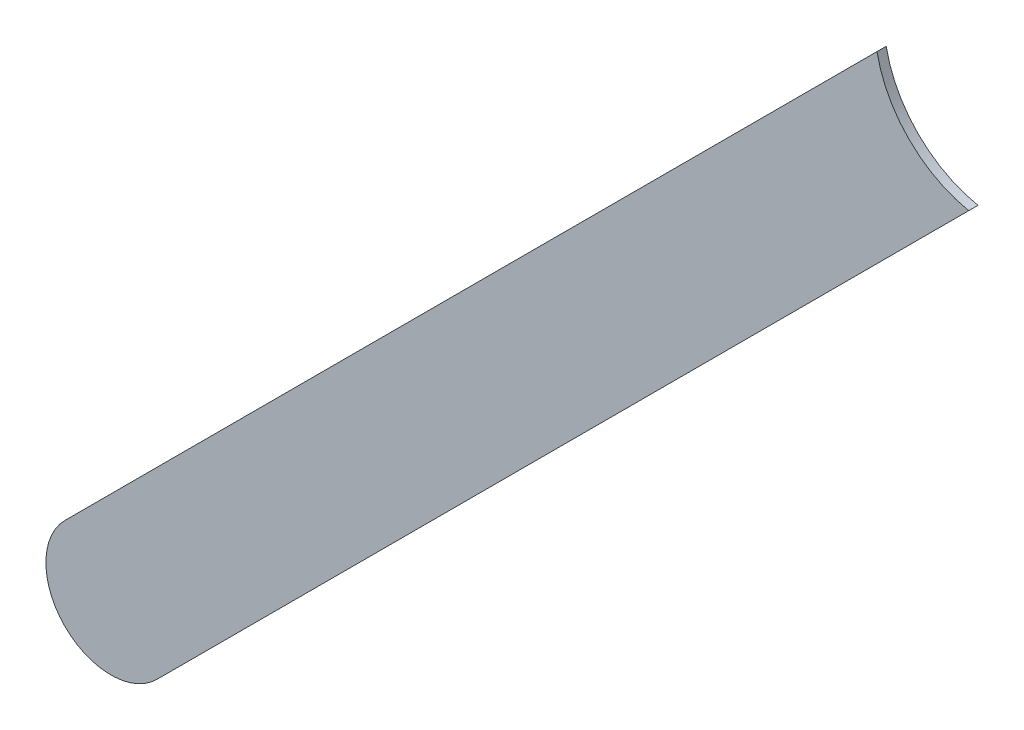
ISO-10303-21;
HEADER;
FILE_DESCRIPTION(('STEP AP214'),'2;1');
FILE_NAME('part.step','',(''),(''),'','','');
FILE_SCHEMA(('AUTOMOTIVE_DESIGN { 1 0 10303 214 1 1 1 1 }'));
ENDSEC;
DATA;
#1=APPLICATION_CONTEXT('core data for automotive mechanical design processes');
#2=APPLICATION_PROTOCOL_DEFINITION('international standard','automotive_design',2000,#1);
#3=PRODUCT_CONTEXT('',#1,'mechanical');
#4=PRODUCT('Part','Part','',(#3));
#5=PRODUCT_RELATED_PRODUCT_CATEGORY('part','',(#4));
#6=PRODUCT_DEFINITION_FORMATION('','',#4);
#7=PRODUCT_DEFINITION_CONTEXT('part definition',#1,'design');
#8=PRODUCT_DEFINITION('design','',#6,#7);
#9=PRODUCT_DEFINITION_SHAPE('','',#8);
#10=(LENGTH_UNIT() NAMED_UNIT(*) SI_UNIT(.MILLI.,.METRE.));
#11=(NAMED_UNIT(*) PLANE_ANGLE_UNIT() SI_UNIT($,.RADIAN.));
#12=(NAMED_UNIT(*) SI_UNIT($,.STERADIAN.) SOLID_ANGLE_UNIT());
#13=UNCERTAINTY_MEASURE_WITH_UNIT(LENGTH_MEASURE(1.E-05),#10,'distance_accuracy_value','');
#14=(GEOMETRIC_REPRESENTATION_CONTEXT(3) GLOBAL_UNCERTAINTY_ASSIGNED_CONTEXT((#13)) GLOBAL_UNIT_ASSIGNED_CONTEXT((#10,
#11,#12)) REPRESENTATION_CONTEXT('',''));
#15=CARTESIAN_POINT('',(0.,0.,0.));
#16=DIRECTION('',(0.,0.,1.));
#17=DIRECTION('',(1.,0.,0.));
#18=AXIS2_PLACEMENT_3D('',#15,#16,#17);
#19=CARTESIAN_POINT('',(88.07677584,113.46023028,0.));
#20=DIRECTION('',(-0.707106781186549,0.707106781186546,0.));
#21=DIRECTION('',(0.707106781186546,0.707106781186549,0.));
#22=AXIS2_PLACEMENT_3D('',#19,#20,#21);
#23=PLANE('',#22);
#24=DIRECTION('',(0.707106781186546,0.707106781186549,0.));
#25=VECTOR('',#24,1.);
#26=CARTESIAN_POINT('',(88.07677584,113.46023028,0.03556));
#27=LINE('',#26,#25);
#28=CARTESIAN_POINT('',(88.07677584,113.46023028,0.03556));
#29=VERTEX_POINT('',#28);
#30=CARTESIAN_POINT('',(91.2032054036052,116.586659843605,0.03556));
#31=VERTEX_POINT('',#30);
#32=EDGE_CURVE('E11',#29,#31,#27,.T.);
#33=ORIENTED_EDGE('',*,*,#32,.F.);
#34=DIRECTION('',(0.,0.,1.));
#35=VECTOR('',#34,1.);
#36=CARTESIAN_POINT('',(88.07677584,113.46023028,0.));
#37=LINE('',#36,#35);
#38=CARTESIAN_POINT('',(88.07677584,113.46023028,0.));
#39=VERTEX_POINT('',#38);
#40=EDGE_CURVE('E24',#39,#29,#37,.T.);
#41=ORIENTED_EDGE('',*,*,#40,.F.);
#42=DIRECTION('',(0.707106781186546,0.707106781186549,0.));
#43=VECTOR('',#42,1.);
#44=CARTESIAN_POINT('',(88.07677584,113.46023028,0.));
#45=LINE('',#44,#43);
#46=CARTESIAN_POINT('',(91.2032054036052,116.586659843605,0.));
#47=VERTEX_POINT('',#46);
#48=EDGE_CURVE('E75',#39,#47,#45,.T.);
#49=ORIENTED_EDGE('',*,*,#48,.T.);
#50=DIRECTION('',(0.,0.,1.));
#51=VECTOR('',#50,1.);
#52=CARTESIAN_POINT('',(91.2032054036052,116.586659843605,0.));
#53=LINE('',#52,#51);
#54=EDGE_CURVE('E37',#47,#31,#53,.T.);
#55=ORIENTED_EDGE('',*,*,#54,.T.);
#56=EDGE_LOOP('',(#33,#41,#49,#55));
#57=FACE_BOUND('',#56,.T.);
#58=ADVANCED_FACE('F17',(#57),#23,.F.);
#59=CARTESIAN_POINT('',(91.2910036,117.0280108,0.));
#60=DIRECTION('',(0.,0.,-1.));
#61=DIRECTION('',(1.,0.,0.));
#62=AXIS2_PLACEMENT_3D('',#59,#60,#61);
#63=CYLINDRICAL_SURFACE('',#62,0.4499991);
#64=DIRECTION('',(0.,0.,1.));
#65=VECTOR('',#64,1.);
#66=CARTESIAN_POINT('',(90.8496526436052,116.940212603605,0.));
#67=LINE('',#66,#65);
#68=CARTESIAN_POINT('',(90.8496526436052,116.940212603605,0.));
#69=VERTEX_POINT('',#68);
#70=CARTESIAN_POINT('',(90.8496526436052,116.940212603605,0.03556));
#71=VERTEX_POINT('',#70);
#72=EDGE_CURVE('E67',#69,#71,#67,.T.);
#73=ORIENTED_EDGE('',*,*,#72,.T.);
#74=CARTESIAN_POINT('',(91.2910036,117.0280108,0.03556));
#75=DIRECTION('',(0.,0.,1.));
#76=DIRECTION('',(1.,0.,0.));
#77=AXIS2_PLACEMENT_3D('',#74,#75,#76);
#78=CIRCLE('',#77,0.4499991);
#79=EDGE_CURVE('E82',#71,#31,#78,.T.);
#80=ORIENTED_EDGE('',*,*,#79,.T.);
#81=ORIENTED_EDGE('',*,*,#54,.F.);
#82=CARTESIAN_POINT('',(91.2910036,117.0280108,0.));
#83=DIRECTION('',(0.,0.,1.));
#84=DIRECTION('',(1.,0.,0.));
#85=AXIS2_PLACEMENT_3D('',#82,#83,#84);
#86=CIRCLE('',#85,0.4499991);
#87=EDGE_CURVE('E80',#69,#47,#86,.T.);
#88=ORIENTED_EDGE('',*,*,#87,.F.);
#89=EDGE_LOOP('',(#73,#80,#81,#88));
#90=FACE_BOUND('',#89,.T.);
#91=ADVANCED_FACE('F88',(#90),#63,.F.);
#92=CARTESIAN_POINT('',(90.8496526436052,116.940212603605,0.));
#93=DIRECTION('',(0.707106781186546,-0.707106781186549,0.));
#94=DIRECTION('',(-0.707106781186549,-0.707106781186546,0.));
#95=AXIS2_PLACEMENT_3D('',#92,#93,#94);
#96=PLANE('',#95);
#97=DIRECTION('',(-0.707106781186549,-0.707106781186546,0.));
#98=VECTOR('',#97,1.);
#99=CARTESIAN_POINT('',(91.11422722,117.20478718,0.03556));
#100=LINE('',#99,#98);
#101=CARTESIAN_POINT('',(87.72322308,113.81378304,0.03556));
#102=VERTEX_POINT('',#101);
#103=EDGE_CURVE('E71',#71,#102,#100,.T.);
#104=ORIENTED_EDGE('',*,*,#103,.F.);
#105=ORIENTED_EDGE('',*,*,#72,.F.);
#106=DIRECTION('',(-0.707106781186549,-0.707106781186546,0.));
#107=VECTOR('',#106,1.);
#108=CARTESIAN_POINT('',(91.11422722,117.20478718,0.));
#109=LINE('',#108,#107);
#110=CARTESIAN_POINT('',(87.72322308,113.81378304,0.));
#111=VERTEX_POINT('',#110);
#112=EDGE_CURVE('E63',#69,#111,#109,.T.);
#113=ORIENTED_EDGE('',*,*,#112,.T.);
#114=DIRECTION('',(0.,0.,1.));
#115=VECTOR('',#114,1.);
#116=CARTESIAN_POINT('',(87.72322308,113.81378304,0.));
#117=LINE('',#116,#115);
#118=EDGE_CURVE('E53',#111,#102,#117,.T.);
#119=ORIENTED_EDGE('',*,*,#118,.T.);
#120=EDGE_LOOP('',(#104,#105,#113,#119));
#121=FACE_BOUND('',#120,.T.);
#122=ADVANCED_FACE('F66',(#121),#96,.F.);
#123=CARTESIAN_POINT('',(87.89999946,113.63700666,0.));
#124=DIRECTION('',(0.,0.,-1.));
#125=DIRECTION('',(-0.707106781186576,0.707106781186519,0.));
#126=AXIS2_PLACEMENT_3D('',#123,#124,#125);
#127=CYLINDRICAL_SURFACE('',#126,0.249999554103223);
#128=CARTESIAN_POINT('',(87.89999946,113.63700666,0.03556));
#129=DIRECTION('',(0.,0.,1.));
#130=DIRECTION('',(-0.707106781186576,0.707106781186519,0.));
#131=AXIS2_PLACEMENT_3D('',#128,#129,#130);
#132=CIRCLE('',#131,0.249999554103223);
#133=EDGE_CURVE('E59',#102,#29,#132,.T.);
#134=ORIENTED_EDGE('',*,*,#133,.F.);
#135=ORIENTED_EDGE('',*,*,#118,.F.);
#136=CARTESIAN_POINT('',(87.89999946,113.63700666,0.));
#137=DIRECTION('',(0.,0.,1.));
#138=DIRECTION('',(-0.707106781186576,0.707106781186519,0.));
#139=AXIS2_PLACEMENT_3D('',#136,#137,#138);
#140=CIRCLE('',#139,0.249999554103223);
#141=EDGE_CURVE('E57',#111,#39,#140,.T.);
#142=ORIENTED_EDGE('',*,*,#141,.T.);
#143=ORIENTED_EDGE('',*,*,#40,.T.);
#144=EDGE_LOOP('',(#134,#135,#142,#143));
#145=FACE_BOUND('',#144,.T.);
#146=ADVANCED_FACE('F55',(#145),#127,.T.);
#147=CARTESIAN_POINT('',(88.07677584,113.46023028,0.));
#148=DIRECTION('',(0.,0.,-1.));
#149=DIRECTION('',(-1.,0.,0.));
#150=AXIS2_PLACEMENT_3D('',#147,#148,#149);
#151=PLANE('',#150);
#152=ORIENTED_EDGE('',*,*,#48,.F.);
#153=ORIENTED_EDGE('',*,*,#141,.F.);
#154=ORIENTED_EDGE('',*,*,#112,.F.);
#155=ORIENTED_EDGE('',*,*,#87,.T.);
#156=EDGE_LOOP('',(#152,#153,#154,#155));
#157=FACE_BOUND('',#156,.T.);
#158=ADVANCED_FACE('F74',(#157),#151,.T.);
#159=CARTESIAN_POINT('',(88.07677584,113.46023028,0.03556));
#160=DIRECTION('',(0.,0.,-1.));
#161=DIRECTION('',(-1.,0.,0.));
#162=AXIS2_PLACEMENT_3D('',#159,#160,#161);
#163=PLANE('',#162);
#164=ORIENTED_EDGE('',*,*,#133,.T.);
#165=ORIENTED_EDGE('',*,*,#32,.T.);
#166=ORIENTED_EDGE('',*,*,#79,.F.);
#167=ORIENTED_EDGE('',*,*,#103,.T.);
#168=EDGE_LOOP('',(#164,#165,#166,#167));
#169=FACE_BOUND('',#168,.T.);
#170=ADVANCED_FACE('F91',(#169),#163,.F.);
#171=CLOSED_SHELL('',(#58,#91,#122,#146,#158,#170));
#172=MANIFOLD_SOLID_BREP('B1',#171);
#173=ADVANCED_BREP_SHAPE_REPRESENTATION('',(#18,#172),#14);
#174=SHAPE_DEFINITION_REPRESENTATION(#9,#173);
ENDSEC;
END-ISO-10303-21;
